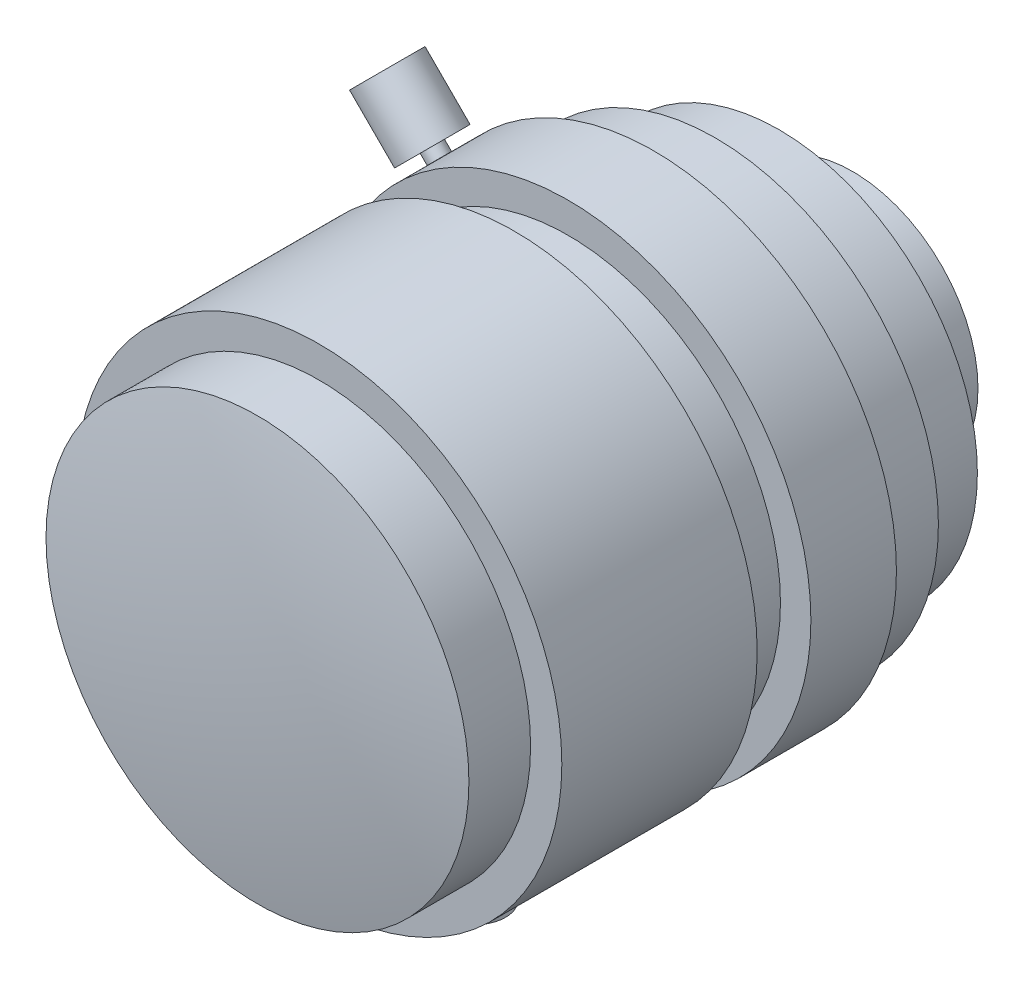
ISO-10303-21;
HEADER;
FILE_DESCRIPTION(('STEP AP214'),'2;1');
FILE_NAME('part.step','',(''),(''),'','','');
FILE_SCHEMA(('AUTOMOTIVE_DESIGN { 1 0 10303 214 1 1 1 1 }'));
ENDSEC;
DATA;
#1=APPLICATION_CONTEXT('core data for automotive mechanical design processes');
#2=APPLICATION_PROTOCOL_DEFINITION('international standard','automotive_design',2000,#1);
#3=PRODUCT_CONTEXT('',#1,'mechanical');
#4=PRODUCT('Part','Part','',(#3));
#5=PRODUCT_RELATED_PRODUCT_CATEGORY('part','',(#4));
#6=PRODUCT_DEFINITION_FORMATION('','',#4);
#7=PRODUCT_DEFINITION_CONTEXT('part definition',#1,'design');
#8=PRODUCT_DEFINITION('design','',#6,#7);
#9=PRODUCT_DEFINITION_SHAPE('','',#8);
#10=(LENGTH_UNIT() NAMED_UNIT(*) SI_UNIT(.MILLI.,.METRE.));
#11=(NAMED_UNIT(*) PLANE_ANGLE_UNIT() SI_UNIT($,.RADIAN.));
#12=(NAMED_UNIT(*) SI_UNIT($,.STERADIAN.) SOLID_ANGLE_UNIT());
#13=UNCERTAINTY_MEASURE_WITH_UNIT(LENGTH_MEASURE(1.E-05),#10,'distance_accuracy_value','');
#14=(GEOMETRIC_REPRESENTATION_CONTEXT(3) GLOBAL_UNCERTAINTY_ASSIGNED_CONTEXT((#13)) GLOBAL_UNIT_ASSIGNED_CONTEXT((#10,
#11,#12)) REPRESENTATION_CONTEXT('',''));
#15=CARTESIAN_POINT('',(0.,0.,0.));
#16=DIRECTION('',(0.,0.,1.));
#17=DIRECTION('',(1.,0.,0.));
#18=AXIS2_PLACEMENT_3D('',#15,#16,#17);
#19=CARTESIAN_POINT('',(-11.4049252737578,11.4049252737579,15.4305));
#20=DIRECTION('',(0.707106781186544,-0.707106781186551,0.));
#21=DIRECTION('',(0.707106781186551,0.707106781186544,0.));
#22=AXIS2_PLACEMENT_3D('',#19,#20,#21);
#23=CYLINDRICAL_SURFACE('',#22,0.635000000000001);
#24=CARTESIAN_POINT('',(-11.4049252737578,11.4049252737579,15.4305));
#25=DIRECTION('',(-0.707106781186544,0.707106781186551,0.));
#26=DIRECTION('',(-0.707106781186551,-0.707106781186544,0.));
#27=AXIS2_PLACEMENT_3D('',#24,#25,#26);
#28=CIRCLE('',#27,0.635000000000001);
#29=CARTESIAN_POINT('',(-11.8539380798112,10.9559124677044,15.4305));
#30=VERTEX_POINT('',#29);
#31=EDGE_CURVE('E11',#30,#30,#28,.T.);
#32=ORIENTED_EDGE('',*,*,#31,.F.);
#33=EDGE_LOOP('',(#32));
#34=FACE_BOUND('',#33,.T.);
#35=CARTESIAN_POINT('',(-10.9559124677043,10.9559124677044,15.4305));
#36=DIRECTION('',(-0.707106781186544,0.707106781186551,0.));
#37=DIRECTION('',(-0.707106781186551,-0.707106781186544,0.));
#38=AXIS2_PLACEMENT_3D('',#35,#36,#37);
#39=CIRCLE('',#38,0.635000000000001);
#40=CARTESIAN_POINT('',(-11.4049252737578,10.506899661651,15.4305));
#41=VERTEX_POINT('',#40);
#42=EDGE_CURVE('E46',#41,#41,#39,.T.);
#43=ORIENTED_EDGE('',*,*,#42,.T.);
#44=EDGE_LOOP('',(#43));
#45=FACE_BOUND('',#44,.T.);
#46=ADVANCED_FACE('F43',(#34,#45),#23,.T.);
#47=CARTESIAN_POINT('',(-10.9559124677043,10.9559124677044,15.4305));
#48=DIRECTION('',(-0.707106781186544,0.707106781186551,0.));
#49=DIRECTION('',(-0.707106781186551,-0.707106781186544,0.));
#50=AXIS2_PLACEMENT_3D('',#47,#48,#49);
#51=PLANE('',#50);
#52=ORIENTED_EDGE('',*,*,#42,.F.);
#53=EDGE_LOOP('',(#52));
#54=FACE_BOUND('',#53,.T.);
#55=ADVANCED_FACE('F71',(#54),#51,.F.);
#56=CARTESIAN_POINT('',(-11.4049252737578,11.4049252737579,15.4305));
#57=DIRECTION('',(-0.707106781186544,0.707106781186551,0.));
#58=DIRECTION('',(-0.707106781186551,-0.707106781186544,0.));
#59=AXIS2_PLACEMENT_3D('',#56,#57,#58);
#60=PLANE('',#59);
#61=CARTESIAN_POINT('',(-11.4049252737578,11.4049252737579,15.4305));
#62=DIRECTION('',(-0.707106781186544,0.707106781186551,0.));
#63=DIRECTION('',(-0.707106781186551,-0.707106781186544,0.));
#64=AXIS2_PLACEMENT_3D('',#61,#62,#63);
#65=CIRCLE('',#64,1.9685);
#66=CARTESIAN_POINT('',(-12.7968649725235,10.0129855749922,15.4305));
#67=VERTEX_POINT('',#66);
#68=EDGE_CURVE('E55',#67,#67,#65,.T.);
#69=ORIENTED_EDGE('',*,*,#68,.F.);
#70=EDGE_LOOP('',(#69));
#71=FACE_BOUND('',#70,.T.);
#72=ORIENTED_EDGE('',*,*,#31,.T.);
#73=EDGE_LOOP('',(#72));
#74=FACE_BOUND('',#73,.T.);
#75=ADVANCED_FACE('F66',(#71,#74),#60,.F.);
#76=CARTESIAN_POINT('',(-14.2786072324999,14.2786072325,15.4305));
#77=DIRECTION('',(0.707106781186544,-0.707106781186551,0.));
#78=DIRECTION('',(0.707106781186551,0.707106781186544,0.));
#79=AXIS2_PLACEMENT_3D('',#76,#77,#78);
#80=CYLINDRICAL_SURFACE('',#79,1.9685);
#81=CARTESIAN_POINT('',(-14.2786072324999,14.2786072325,15.4305));
#82=DIRECTION('',(-0.707106781186544,0.707106781186551,0.));
#83=DIRECTION('',(-0.707106781186551,-0.707106781186544,0.));
#84=AXIS2_PLACEMENT_3D('',#81,#82,#83);
#85=CIRCLE('',#84,1.9685);
#86=CARTESIAN_POINT('',(-15.6705469312656,12.8866675337343,15.4305));
#87=VERTEX_POINT('',#86);
#88=EDGE_CURVE('E53',#87,#87,#85,.T.);
#89=ORIENTED_EDGE('',*,*,#88,.F.);
#90=EDGE_LOOP('',(#89));
#91=FACE_BOUND('',#90,.T.);
#92=ORIENTED_EDGE('',*,*,#68,.T.);
#93=EDGE_LOOP('',(#92));
#94=FACE_BOUND('',#93,.T.);
#95=ADVANCED_FACE('F63',(#91,#94),#80,.T.);
#96=CARTESIAN_POINT('',(-14.2786072324999,14.2786072325,15.4305));
#97=DIRECTION('',(-0.707106781186544,0.707106781186551,0.));
#98=DIRECTION('',(-0.707106781186551,-0.707106781186544,0.));
#99=AXIS2_PLACEMENT_3D('',#96,#97,#98);
#100=PLANE('',#99);
#101=ORIENTED_EDGE('',*,*,#88,.T.);
#102=EDGE_LOOP('',(#101));
#103=FACE_BOUND('',#102,.T.);
#104=ADVANCED_FACE('F61',(#103),#100,.T.);
#105=CLOSED_SHELL('',(#46,#55,#75,#95,#104));
#106=MANIFOLD_SOLID_BREP('B2',#105);
#107=CARTESIAN_POINT('',(0.,-16.129,24.13));
#108=DIRECTION('',(0.,1.,0.));
#109=DIRECTION('',(0.,0.,1.));
#110=AXIS2_PLACEMENT_3D('',#107,#108,#109);
#111=CYLINDRICAL_SURFACE('',#110,0.634999999999999);
#112=CARTESIAN_POINT('',(0.,-16.129,24.13));
#113=DIRECTION('',(0.,-1.,0.));
#114=DIRECTION('',(0.,0.,-1.));
#115=AXIS2_PLACEMENT_3D('',#112,#113,#114);
#116=CIRCLE('',#115,0.634999999999999);
#117=CARTESIAN_POINT('',(0.,-16.129,23.495));
#118=VERTEX_POINT('',#117);
#119=EDGE_CURVE('E42',#118,#118,#116,.T.);
#120=ORIENTED_EDGE('',*,*,#119,.F.);
#121=EDGE_LOOP('',(#120));
#122=FACE_BOUND('',#121,.T.);
#123=CARTESIAN_POINT('',(0.,-15.494,24.13));
#124=DIRECTION('',(0.,-1.,0.));
#125=DIRECTION('',(0.,0.,-1.));
#126=AXIS2_PLACEMENT_3D('',#123,#124,#125);
#127=CIRCLE('',#126,0.634999999999999);
#128=CARTESIAN_POINT('',(0.,-15.494,23.495));
#129=VERTEX_POINT('',#128);
#130=EDGE_CURVE('E123',#129,#129,#127,.T.);
#131=ORIENTED_EDGE('',*,*,#130,.T.);
#132=EDGE_LOOP('',(#131));
#133=FACE_BOUND('',#132,.T.);
#134=ADVANCED_FACE('F120',(#122,#133),#111,.T.);
#135=CARTESIAN_POINT('',(0.,-15.494,24.13));
#136=DIRECTION('',(0.,-1.,0.));
#137=DIRECTION('',(0.,0.,-1.));
#138=AXIS2_PLACEMENT_3D('',#135,#136,#137);
#139=PLANE('',#138);
#140=ORIENTED_EDGE('',*,*,#130,.F.);
#141=EDGE_LOOP('',(#140));
#142=FACE_BOUND('',#141,.T.);
#143=ADVANCED_FACE('F148',(#142),#139,.F.);
#144=CARTESIAN_POINT('',(0.,-16.129,24.13));
#145=DIRECTION('',(0.,-1.,0.));
#146=DIRECTION('',(0.,0.,-1.));
#147=AXIS2_PLACEMENT_3D('',#144,#145,#146);
#148=PLANE('',#147);
#149=CARTESIAN_POINT('',(0.,-16.129,24.13));
#150=DIRECTION('',(0.,-1.,0.));
#151=DIRECTION('',(0.,0.,-1.));
#152=AXIS2_PLACEMENT_3D('',#149,#150,#151);
#153=CIRCLE('',#152,1.9685);
#154=CARTESIAN_POINT('',(0.,-16.129,22.1615));
#155=VERTEX_POINT('',#154);
#156=EDGE_CURVE('E132',#155,#155,#153,.T.);
#157=ORIENTED_EDGE('',*,*,#156,.F.);
#158=EDGE_LOOP('',(#157));
#159=FACE_BOUND('',#158,.T.);
#160=ORIENTED_EDGE('',*,*,#119,.T.);
#161=EDGE_LOOP('',(#160));
#162=FACE_BOUND('',#161,.T.);
#163=ADVANCED_FACE('F143',(#159,#162),#148,.F.);
#164=CARTESIAN_POINT('',(0.,-20.193,24.13));
#165=DIRECTION('',(0.,1.,0.));
#166=DIRECTION('',(0.,0.,1.));
#167=AXIS2_PLACEMENT_3D('',#164,#165,#166);
#168=CYLINDRICAL_SURFACE('',#167,1.9685);
#169=CARTESIAN_POINT('',(0.,-20.193,24.13));
#170=DIRECTION('',(0.,-1.,0.));
#171=DIRECTION('',(0.,0.,-1.));
#172=AXIS2_PLACEMENT_3D('',#169,#170,#171);
#173=CIRCLE('',#172,1.9685);
#174=CARTESIAN_POINT('',(0.,-20.193,22.1615));
#175=VERTEX_POINT('',#174);
#176=EDGE_CURVE('E130',#175,#175,#173,.T.);
#177=ORIENTED_EDGE('',*,*,#176,.F.);
#178=EDGE_LOOP('',(#177));
#179=FACE_BOUND('',#178,.T.);
#180=ORIENTED_EDGE('',*,*,#156,.T.);
#181=EDGE_LOOP('',(#180));
#182=FACE_BOUND('',#181,.T.);
#183=ADVANCED_FACE('F140',(#179,#182),#168,.T.);
#184=CARTESIAN_POINT('',(0.,-20.193,24.13));
#185=DIRECTION('',(0.,-1.,0.));
#186=DIRECTION('',(0.,0.,-1.));
#187=AXIS2_PLACEMENT_3D('',#184,#185,#186);
#188=PLANE('',#187);
#189=ORIENTED_EDGE('',*,*,#176,.T.);
#190=EDGE_LOOP('',(#189));
#191=FACE_BOUND('',#190,.T.);
#192=ADVANCED_FACE('F138',(#191),#188,.T.);
#193=CLOSED_SHELL('',(#134,#143,#163,#183,#192));
#194=MANIFOLD_SOLID_BREP('B6',#193);
#195=CARTESIAN_POINT('',(0.,0.,34.0614));
#196=DIRECTION('',(0.,0.,1.));
#197=DIRECTION('',(1.,0.,0.));
#198=AXIS2_PLACEMENT_3D('',#195,#196,#197);
#199=PLANE('',#198);
#200=CARTESIAN_POINT('',(0.,0.,34.0614));
#201=DIRECTION('',(0.,0.,1.));
#202=DIRECTION('',(1.,0.,0.));
#203=AXIS2_PLACEMENT_3D('',#200,#201,#202);
#204=CIRCLE('',#203,15.494);
#205=CARTESIAN_POINT('',(15.494,0.,34.0614));
#206=VERTEX_POINT('',#205);
#207=EDGE_CURVE('E228',#206,#206,#204,.T.);
#208=ORIENTED_EDGE('',*,*,#207,.T.);
#209=EDGE_LOOP('',(#208));
#210=FACE_BOUND('',#209,.T.);
#211=CARTESIAN_POINT('',(0.,0.,34.0614));
#212=DIRECTION('',(0.,0.,1.));
#213=DIRECTION('',(1.,0.,0.));
#214=AXIS2_PLACEMENT_3D('',#211,#212,#213);
#215=CIRCLE('',#214,13.5001);
#216=CARTESIAN_POINT('',(13.5001,0.,34.0614));
#217=VERTEX_POINT('',#216);
#218=EDGE_CURVE('E236',#217,#217,#215,.T.);
#219=ORIENTED_EDGE('',*,*,#218,.F.);
#220=EDGE_LOOP('',(#219));
#221=FACE_BOUND('',#220,.T.);
#222=ADVANCED_FACE('F192',(#210,#221),#199,.T.);
#223=CARTESIAN_POINT('',(0.,0.,18.161));
#224=DIRECTION('',(0.,0.,1.));
#225=DIRECTION('',(1.,0.,0.));
#226=AXIS2_PLACEMENT_3D('',#223,#224,#225);
#227=PLANE('',#226);
#228=CARTESIAN_POINT('',(0.,0.,18.161));
#229=DIRECTION('',(0.,0.,1.));
#230=DIRECTION('',(1.,0.,0.));
#231=AXIS2_PLACEMENT_3D('',#228,#229,#230);
#232=CIRCLE('',#231,15.494);
#233=CARTESIAN_POINT('',(15.494,0.,18.161));
#234=VERTEX_POINT('',#233);
#235=EDGE_CURVE('E216',#234,#234,#232,.T.);
#236=ORIENTED_EDGE('',*,*,#235,.T.);
#237=EDGE_LOOP('',(#236));
#238=FACE_BOUND('',#237,.T.);
#239=CARTESIAN_POINT('',(0.,0.,18.161));
#240=DIRECTION('',(0.,0.,1.));
#241=DIRECTION('',(1.,0.,0.));
#242=AXIS2_PLACEMENT_3D('',#239,#240,#241);
#243=CIRCLE('',#242,13.5509);
#244=CARTESIAN_POINT('',(13.5509,0.,18.161));
#245=VERTEX_POINT('',#244);
#246=EDGE_CURVE('E225',#245,#245,#243,.T.);
#247=ORIENTED_EDGE('',*,*,#246,.F.);
#248=EDGE_LOOP('',(#247));
#249=FACE_BOUND('',#248,.T.);
#250=ADVANCED_FACE('F257',(#238,#249),#227,.T.);
#251=CARTESIAN_POINT('',(0.,0.,4.699));
#252=DIRECTION('',(0.,0.,-1.));
#253=DIRECTION('',(-1.,0.,0.));
#254=AXIS2_PLACEMENT_3D('',#251,#252,#253);
#255=CYLINDRICAL_SURFACE('',#254,8.001);
#256=CARTESIAN_POINT('',(0.,0.,4.699));
#257=DIRECTION('',(0.,0.,1.));
#258=DIRECTION('',(1.,0.,0.));
#259=AXIS2_PLACEMENT_3D('',#256,#257,#258);
#260=CIRCLE('',#259,8.001);
#261=CARTESIAN_POINT('',(8.001,0.,4.699));
#262=VERTEX_POINT('',#261);
#263=EDGE_CURVE('E119',#262,#262,#260,.T.);
#264=ORIENTED_EDGE('',*,*,#263,.F.);
#265=EDGE_LOOP('',(#264));
#266=FACE_BOUND('',#265,.T.);
#267=CARTESIAN_POINT('',(0.,0.,0.));
#268=DIRECTION('',(0.,0.,1.));
#269=DIRECTION('',(1.,0.,0.));
#270=AXIS2_PLACEMENT_3D('',#267,#268,#269);
#271=CIRCLE('',#270,8.001);
#272=CARTESIAN_POINT('',(8.001,0.,0.));
#273=VERTEX_POINT('',#272);
#274=EDGE_CURVE('E200',#273,#273,#271,.T.);
#275=ORIENTED_EDGE('',*,*,#274,.T.);
#276=EDGE_LOOP('',(#275));
#277=FACE_BOUND('',#276,.T.);
#278=ADVANCED_FACE('F262',(#266,#277),#255,.T.);
#279=CARTESIAN_POINT('',(0.,0.,0.));
#280=DIRECTION('',(0.,0.,1.));
#281=DIRECTION('',(1.,0.,0.));
#282=AXIS2_PLACEMENT_3D('',#279,#280,#281);
#283=PLANE('',#282);
#284=ORIENTED_EDGE('',*,*,#274,.F.);
#285=EDGE_LOOP('',(#284));
#286=FACE_BOUND('',#285,.T.);
#287=ADVANCED_FACE('F294',(#286),#283,.F.);
#288=CARTESIAN_POINT('',(0.,0.,4.699));
#289=DIRECTION('',(0.,0.,1.));
#290=DIRECTION('',(1.,0.,0.));
#291=AXIS2_PLACEMENT_3D('',#288,#289,#290);
#292=PLANE('',#291);
#293=CARTESIAN_POINT('',(0.,0.,4.699));
#294=DIRECTION('',(0.,0.,1.));
#295=DIRECTION('',(1.,0.,0.));
#296=AXIS2_PLACEMENT_3D('',#293,#294,#295);
#297=CIRCLE('',#296,12.6619);
#298=CARTESIAN_POINT('',(12.6619,0.,4.699));
#299=VERTEX_POINT('',#298);
#300=EDGE_CURVE('E207',#299,#299,#297,.T.);
#301=ORIENTED_EDGE('',*,*,#300,.F.);
#302=EDGE_LOOP('',(#301));
#303=FACE_BOUND('',#302,.T.);
#304=ORIENTED_EDGE('',*,*,#263,.T.);
#305=EDGE_LOOP('',(#304));
#306=FACE_BOUND('',#305,.T.);
#307=ADVANCED_FACE('F291',(#303,#306),#292,.F.);
#308=CARTESIAN_POINT('',(0.,0.,8.763));
#309=DIRECTION('',(0.,0.,-1.));
#310=DIRECTION('',(-1.,0.,0.));
#311=AXIS2_PLACEMENT_3D('',#308,#309,#310);
#312=CYLINDRICAL_SURFACE('',#311,12.6619);
#313=CARTESIAN_POINT('',(0.,0.,8.763));
#314=DIRECTION('',(0.,0.,1.));
#315=DIRECTION('',(1.,0.,0.));
#316=AXIS2_PLACEMENT_3D('',#313,#314,#315);
#317=CIRCLE('',#316,12.6619);
#318=CARTESIAN_POINT('',(12.6619,0.,8.763));
#319=VERTEX_POINT('',#318);
#320=EDGE_CURVE('E205',#319,#319,#317,.T.);
#321=ORIENTED_EDGE('',*,*,#320,.F.);
#322=EDGE_LOOP('',(#321));
#323=FACE_BOUND('',#322,.T.);
#324=ORIENTED_EDGE('',*,*,#300,.T.);
#325=EDGE_LOOP('',(#324));
#326=FACE_BOUND('',#325,.T.);
#327=ADVANCED_FACE('F286',(#323,#326),#312,.T.);
#328=CARTESIAN_POINT('',(0.,0.,8.763));
#329=DIRECTION('',(0.,0.,1.));
#330=DIRECTION('',(1.,0.,0.));
#331=AXIS2_PLACEMENT_3D('',#328,#329,#330);
#332=PLANE('',#331);
#333=CARTESIAN_POINT('',(0.,0.,8.763));
#334=DIRECTION('',(0.,0.,1.));
#335=DIRECTION('',(1.,0.,0.));
#336=AXIS2_PLACEMENT_3D('',#333,#334,#335);
#337=CIRCLE('',#336,14.2367);
#338=CARTESIAN_POINT('',(14.2367,0.,8.763));
#339=VERTEX_POINT('',#338);
#340=EDGE_CURVE('E213',#339,#339,#337,.T.);
#341=ORIENTED_EDGE('',*,*,#340,.F.);
#342=EDGE_LOOP('',(#341));
#343=FACE_BOUND('',#342,.T.);
#344=ORIENTED_EDGE('',*,*,#320,.T.);
#345=EDGE_LOOP('',(#344));
#346=FACE_BOUND('',#345,.T.);
#347=ADVANCED_FACE('F283',(#343,#346),#332,.F.);
#348=CARTESIAN_POINT('',(0.,0.,12.7));
#349=DIRECTION('',(0.,0.,-1.));
#350=DIRECTION('',(-1.,0.,0.));
#351=AXIS2_PLACEMENT_3D('',#348,#349,#350);
#352=CYLINDRICAL_SURFACE('',#351,14.2367);
#353=CARTESIAN_POINT('',(0.,0.,12.7));
#354=DIRECTION('',(0.,0.,1.));
#355=DIRECTION('',(1.,0.,0.));
#356=AXIS2_PLACEMENT_3D('',#353,#354,#355);
#357=CIRCLE('',#356,14.2367);
#358=CARTESIAN_POINT('',(14.2367,0.,12.7));
#359=VERTEX_POINT('',#358);
#360=EDGE_CURVE('E210',#359,#359,#357,.T.);
#361=ORIENTED_EDGE('',*,*,#360,.F.);
#362=EDGE_LOOP('',(#361));
#363=FACE_BOUND('',#362,.T.);
#364=ORIENTED_EDGE('',*,*,#340,.T.);
#365=EDGE_LOOP('',(#364));
#366=FACE_BOUND('',#365,.T.);
#367=ADVANCED_FACE('F278',(#363,#366),#352,.T.);
#368=CARTESIAN_POINT('',(0.,0.,12.7));
#369=DIRECTION('',(0.,0.,1.));
#370=DIRECTION('',(1.,0.,0.));
#371=AXIS2_PLACEMENT_3D('',#368,#369,#370);
#372=PLANE('',#371);
#373=CARTESIAN_POINT('',(0.,0.,12.7));
#374=DIRECTION('',(0.,0.,1.));
#375=DIRECTION('',(1.,0.,0.));
#376=AXIS2_PLACEMENT_3D('',#373,#374,#375);
#377=CIRCLE('',#376,15.494);
#378=CARTESIAN_POINT('',(15.494,0.,12.7));
#379=VERTEX_POINT('',#378);
#380=EDGE_CURVE('E219',#379,#379,#377,.T.);
#381=ORIENTED_EDGE('',*,*,#380,.F.);
#382=EDGE_LOOP('',(#381));
#383=FACE_BOUND('',#382,.T.);
#384=ORIENTED_EDGE('',*,*,#360,.T.);
#385=EDGE_LOOP('',(#384));
#386=FACE_BOUND('',#385,.T.);
#387=ADVANCED_FACE('F275',(#383,#386),#372,.F.);
#388=CARTESIAN_POINT('',(0.,0.,18.161));
#389=DIRECTION('',(0.,0.,-1.));
#390=DIRECTION('',(-1.,0.,0.));
#391=AXIS2_PLACEMENT_3D('',#388,#389,#390);
#392=CYLINDRICAL_SURFACE('',#391,15.494);
#393=ORIENTED_EDGE('',*,*,#235,.F.);
#394=EDGE_LOOP('',(#393));
#395=FACE_BOUND('',#394,.T.);
#396=ORIENTED_EDGE('',*,*,#380,.T.);
#397=EDGE_LOOP('',(#396));
#398=FACE_BOUND('',#397,.T.);
#399=ADVANCED_FACE('F272',(#395,#398),#392,.T.);
#400=CARTESIAN_POINT('',(0.,0.,21.59));
#401=DIRECTION('',(0.,0.,-1.));
#402=DIRECTION('',(-1.,0.,0.));
#403=AXIS2_PLACEMENT_3D('',#400,#401,#402);
#404=CYLINDRICAL_SURFACE('',#403,13.5509);
#405=CARTESIAN_POINT('',(0.,0.,21.59));
#406=DIRECTION('',(0.,0.,1.));
#407=DIRECTION('',(1.,0.,0.));
#408=AXIS2_PLACEMENT_3D('',#405,#406,#407);
#409=CIRCLE('',#408,13.5509);
#410=CARTESIAN_POINT('',(13.5509,0.,21.59));
#411=VERTEX_POINT('',#410);
#412=EDGE_CURVE('E222',#411,#411,#409,.T.);
#413=ORIENTED_EDGE('',*,*,#412,.F.);
#414=EDGE_LOOP('',(#413));
#415=FACE_BOUND('',#414,.T.);
#416=ORIENTED_EDGE('',*,*,#246,.T.);
#417=EDGE_LOOP('',(#416));
#418=FACE_BOUND('',#417,.T.);
#419=ADVANCED_FACE('F268',(#415,#418),#404,.T.);
#420=CARTESIAN_POINT('',(0.,0.,21.59));
#421=DIRECTION('',(0.,0.,1.));
#422=DIRECTION('',(1.,0.,0.));
#423=AXIS2_PLACEMENT_3D('',#420,#421,#422);
#424=PLANE('',#423);
#425=CARTESIAN_POINT('',(0.,0.,21.59));
#426=DIRECTION('',(0.,0.,1.));
#427=DIRECTION('',(1.,0.,0.));
#428=AXIS2_PLACEMENT_3D('',#425,#426,#427);
#429=CIRCLE('',#428,15.494);
#430=CARTESIAN_POINT('',(15.494,0.,21.59));
#431=VERTEX_POINT('',#430);
#432=EDGE_CURVE('E231',#431,#431,#429,.T.);
#433=ORIENTED_EDGE('',*,*,#432,.F.);
#434=EDGE_LOOP('',(#433));
#435=FACE_BOUND('',#434,.T.);
#436=ORIENTED_EDGE('',*,*,#412,.T.);
#437=EDGE_LOOP('',(#436));
#438=FACE_BOUND('',#437,.T.);
#439=ADVANCED_FACE('F252',(#435,#438),#424,.F.);
#440=CARTESIAN_POINT('',(0.,0.,34.0614));
#441=DIRECTION('',(0.,0.,-1.));
#442=DIRECTION('',(-1.,0.,0.));
#443=AXIS2_PLACEMENT_3D('',#440,#441,#442);
#444=CYLINDRICAL_SURFACE('',#443,15.494);
#445=ORIENTED_EDGE('',*,*,#207,.F.);
#446=EDGE_LOOP('',(#445));
#447=FACE_BOUND('',#446,.T.);
#448=ORIENTED_EDGE('',*,*,#432,.T.);
#449=EDGE_LOOP('',(#448));
#450=FACE_BOUND('',#449,.T.);
#451=ADVANCED_FACE('F246',(#447,#450),#444,.T.);
#452=CARTESIAN_POINT('',(0.,0.,37.9984));
#453=DIRECTION('',(0.,0.,-1.));
#454=DIRECTION('',(-1.,0.,0.));
#455=AXIS2_PLACEMENT_3D('',#452,#453,#454);
#456=CYLINDRICAL_SURFACE('',#455,13.5001);
#457=CARTESIAN_POINT('',(0.,0.,37.9984));
#458=DIRECTION('',(0.,0.,1.));
#459=DIRECTION('',(1.,0.,0.));
#460=AXIS2_PLACEMENT_3D('',#457,#458,#459);
#461=CIRCLE('',#460,13.5001);
#462=CARTESIAN_POINT('',(13.5001,0.,37.9984));
#463=VERTEX_POINT('',#462);
#464=EDGE_CURVE('E196',#463,#463,#461,.T.);
#465=ORIENTED_EDGE('',*,*,#464,.F.);
#466=EDGE_LOOP('',(#465));
#467=FACE_BOUND('',#466,.T.);
#468=ORIENTED_EDGE('',*,*,#218,.T.);
#469=EDGE_LOOP('',(#468));
#470=FACE_BOUND('',#469,.T.);
#471=ADVANCED_FACE('F244',(#467,#470),#456,.T.);
#472=CARTESIAN_POINT('',(0.,0.,-33.1196315));
#473=DIRECTION('',(0.,0.,1.));
#474=DIRECTION('',(1.,0.,0.));
#475=AXIS2_PLACEMENT_3D('',#472,#473,#474);
#476=SPHERICAL_SURFACE('',#475,72.3880315);
#477=ORIENTED_EDGE('',*,*,#464,.T.);
#478=EDGE_LOOP('',(#477));
#479=FACE_BOUND('',#478,.T.);
#480=ADVANCED_FACE('F194',(#479),#476,.T.);
#481=CLOSED_SHELL('',(#222,#250,#278,#287,#307,#327,#347,#367,#387,#399,#419,#439,#451,#471,#480));
#482=MANIFOLD_SOLID_BREP('B37',#481);
#483=ADVANCED_BREP_SHAPE_REPRESENTATION('',(#18,#106,#194,#482),#14);
#484=SHAPE_DEFINITION_REPRESENTATION(#9,#483);
ENDSEC;
END-ISO-10303-21;
